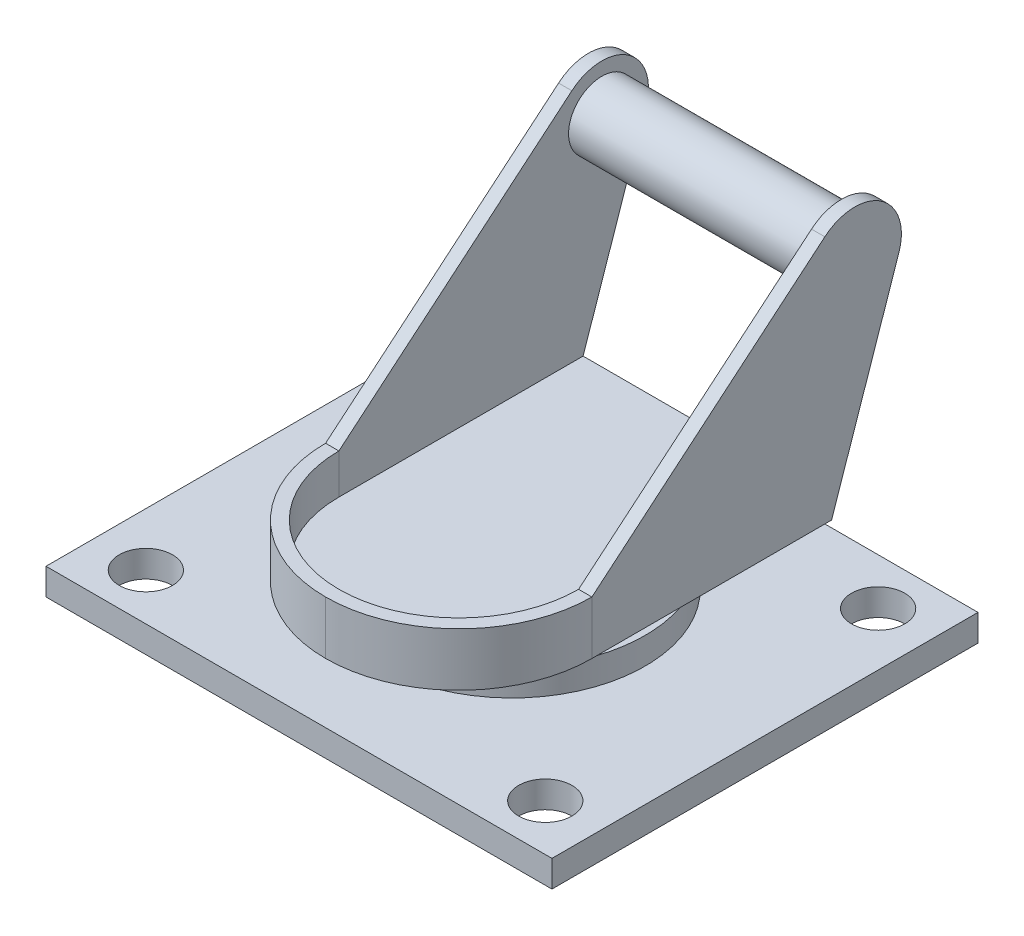
ISO-10303-21;
HEADER;
FILE_DESCRIPTION(('STEP AP214'),'2;1');
FILE_NAME('part.step','',(''),(''),'','','');
FILE_SCHEMA(('AUTOMOTIVE_DESIGN { 1 0 10303 214 1 1 1 1 }'));
ENDSEC;
DATA;
#1=APPLICATION_CONTEXT('core data for automotive mechanical design processes');
#2=APPLICATION_PROTOCOL_DEFINITION('international standard','automotive_design',2000,#1);
#3=PRODUCT_CONTEXT('',#1,'mechanical');
#4=PRODUCT('Part','Part','',(#3));
#5=PRODUCT_RELATED_PRODUCT_CATEGORY('part','',(#4));
#6=PRODUCT_DEFINITION_FORMATION('','',#4);
#7=PRODUCT_DEFINITION_CONTEXT('part definition',#1,'design');
#8=PRODUCT_DEFINITION('design','',#6,#7);
#9=PRODUCT_DEFINITION_SHAPE('','',#8);
#10=(LENGTH_UNIT() NAMED_UNIT(*) SI_UNIT(.MILLI.,.METRE.));
#11=(NAMED_UNIT(*) PLANE_ANGLE_UNIT() SI_UNIT($,.RADIAN.));
#12=(NAMED_UNIT(*) SI_UNIT($,.STERADIAN.) SOLID_ANGLE_UNIT());
#13=UNCERTAINTY_MEASURE_WITH_UNIT(LENGTH_MEASURE(1.E-05),#10,'distance_accuracy_value','');
#14=(GEOMETRIC_REPRESENTATION_CONTEXT(3) GLOBAL_UNCERTAINTY_ASSIGNED_CONTEXT((#13)) GLOBAL_UNIT_ASSIGNED_CONTEXT((#10,
#11,#12)) REPRESENTATION_CONTEXT('',''));
#15=CARTESIAN_POINT('',(0.,0.,0.));
#16=DIRECTION('',(0.,0.,1.));
#17=DIRECTION('',(1.,0.,0.));
#18=AXIS2_PLACEMENT_3D('',#15,#16,#17);
#19=CARTESIAN_POINT('',(10.,4.5,-14.));
#20=DIRECTION('',(0.,0.322065077503266,0.946717532241172));
#21=DIRECTION('',(0.,-0.946717532241172,0.322065077503266));
#22=AXIS2_PLACEMENT_3D('',#19,#20,#21);
#23=PLANE('',#22);
#24=DIRECTION('',(0.,0.946717532241172,-0.322065077503266));
#25=VECTOR('',#24,1.);
#26=CARTESIAN_POINT('',(-9.,4.5,-14.));
#27=LINE('',#26,#25);
#28=CARTESIAN_POINT('',(-9.,5.5,-14.3401913100107));
#29=VERTEX_POINT('',#28);
#30=CARTESIAN_POINT('',(-9.,19.3727722287386,-19.059587867986));
#31=VERTEX_POINT('',#30);
#32=EDGE_CURVE('E166',#29,#31,#27,.T.);
#33=ORIENTED_EDGE('',*,*,#32,.F.);
#34=DIRECTION('',(-1.,0.,0.));
#35=VECTOR('',#34,1.);
#36=CARTESIAN_POINT('',(10.,5.5,-14.3401913100107));
#37=LINE('',#36,#35);
#38=CARTESIAN_POINT('',(9.,5.5,-14.3401913100107));
#39=VERTEX_POINT('',#38);
#40=EDGE_CURVE('E178',#39,#29,#37,.T.);
#41=ORIENTED_EDGE('',*,*,#40,.F.);
#42=DIRECTION('',(0.,0.946717532241172,-0.322065077503266));
#43=VECTOR('',#42,1.);
#44=CARTESIAN_POINT('',(9.,4.5,-14.));
#45=LINE('',#44,#43);
#46=CARTESIAN_POINT('',(9.,19.3727722287386,-19.059587867986));
#47=VERTEX_POINT('',#46);
#48=EDGE_CURVE('E203',#39,#47,#45,.T.);
#49=ORIENTED_EDGE('',*,*,#48,.T.);
#50=DIRECTION('',(-1.,0.,0.));
#51=VECTOR('',#50,1.);
#52=CARTESIAN_POINT('',(10.,19.3727722287386,-19.059587867986));
#53=LINE('',#52,#51);
#54=CARTESIAN_POINT('',(10.,19.3727722287386,-19.059587867986));
#55=VERTEX_POINT('',#54);
#56=EDGE_CURVE('E246',#55,#47,#53,.T.);
#57=ORIENTED_EDGE('',*,*,#56,.F.);
#58=DIRECTION('',(0.,0.946717532241172,-0.322065077503266));
#59=VECTOR('',#58,1.);
#60=CARTESIAN_POINT('',(10.,4.5,-14.));
#61=LINE('',#60,#59);
#62=CARTESIAN_POINT('',(10.,4.5,-14.));
#63=VERTEX_POINT('',#62);
#64=EDGE_CURVE('E210',#63,#55,#61,.T.);
#65=ORIENTED_EDGE('',*,*,#64,.F.);
#66=DIRECTION('',(-1.,0.,0.));
#67=VECTOR('',#66,1.);
#68=CARTESIAN_POINT('',(10.,4.5,-14.));
#69=LINE('',#68,#67);
#70=CARTESIAN_POINT('',(-10.,4.5,-14.));
#71=VERTEX_POINT('',#70);
#72=EDGE_CURVE('E250',#63,#71,#69,.T.);
#73=ORIENTED_EDGE('',*,*,#72,.T.);
#74=DIRECTION('',(0.,0.946717532241172,-0.322065077503266));
#75=VECTOR('',#74,1.);
#76=CARTESIAN_POINT('',(-10.,4.5,-14.));
#77=LINE('',#76,#75);
#78=CARTESIAN_POINT('',(-10.,19.3727722287386,-19.059587867986));
#79=VERTEX_POINT('',#78);
#80=EDGE_CURVE('E225',#71,#79,#77,.T.);
#81=ORIENTED_EDGE('',*,*,#80,.T.);
#82=EDGE_CURVE('E245',#31,#79,#53,.T.);
#83=ORIENTED_EDGE('',*,*,#82,.F.);
#84=EDGE_LOOP('',(#33,#41,#49,#57,#65,#73,#81,#83));
#85=FACE_BOUND('',#84,.T.);
#86=ADVANCED_FACE('F51',(#85),#23,.F.);
#87=CARTESIAN_POINT('',(10.,20.5,-15.7460765051419));
#88=DIRECTION('',(-1.,0.,0.));
#89=DIRECTION('',(0.,0.,1.));
#90=AXIS2_PLACEMENT_3D('',#87,#88,#89);
#91=CYLINDRICAL_SURFACE('',#90,3.5);
#92=CARTESIAN_POINT('',(-9.,20.5,-15.7460765051419));
#93=DIRECTION('',(1.,0.,0.));
#94=DIRECTION('',(0.,0.,-1.));
#95=AXIS2_PLACEMENT_3D('',#92,#93,#94);
#96=CIRCLE('',#95,3.5);
#97=CARTESIAN_POINT('',(-9.,23.1811555509164,-13.496319871239));
#98=VERTEX_POINT('',#97);
#99=EDGE_CURVE('E184',#31,#98,#96,.T.);
#100=ORIENTED_EDGE('',*,*,#99,.F.);
#101=ORIENTED_EDGE('',*,*,#82,.T.);
#102=CARTESIAN_POINT('',(-10.,20.5,-15.7460765051419));
#103=DIRECTION('',(1.,0.,0.));
#104=DIRECTION('',(0.,0.,-1.));
#105=AXIS2_PLACEMENT_3D('',#102,#103,#104);
#106=CIRCLE('',#105,3.5);
#107=CARTESIAN_POINT('',(-10.,23.1811555509164,-13.496319871239));
#108=VERTEX_POINT('',#107);
#109=EDGE_CURVE('E229',#79,#108,#106,.T.);
#110=ORIENTED_EDGE('',*,*,#109,.T.);
#111=DIRECTION('',(-1.,0.,0.));
#112=VECTOR('',#111,1.);
#113=CARTESIAN_POINT('',(10.,23.1811555509164,-13.496319871239));
#114=LINE('',#113,#112);
#115=EDGE_CURVE('E240',#98,#108,#114,.T.);
#116=ORIENTED_EDGE('',*,*,#115,.F.);
#117=EDGE_LOOP('',(#100,#101,#110,#116));
#118=FACE_BOUND('',#117,.T.);
#119=ADVANCED_FACE('F333',(#118),#91,.T.);
#120=CARTESIAN_POINT('',(10.,8.5,4.));
#121=DIRECTION('',(0.,-0.766044443118977,-0.64278760968654));
#122=DIRECTION('',(0.,0.64278760968654,-0.766044443118977));
#123=AXIS2_PLACEMENT_3D('',#120,#121,#122);
#124=PLANE('',#123);
#125=DIRECTION('',(0.,-0.64278760968654,0.766044443118977));
#126=VECTOR('',#125,1.);
#127=CARTESIAN_POINT('',(-9.,8.5,4.));
#128=LINE('',#127,#126);
#129=CARTESIAN_POINT('',(-9.,8.5,4.));
#130=VERTEX_POINT('',#129);
#131=EDGE_CURVE('E187',#98,#130,#128,.T.);
#132=ORIENTED_EDGE('',*,*,#131,.F.);
#133=ORIENTED_EDGE('',*,*,#115,.T.);
#134=DIRECTION('',(0.,-0.64278760968654,0.766044443118977));
#135=VECTOR('',#134,1.);
#136=CARTESIAN_POINT('',(-10.,8.5,4.));
#137=LINE('',#136,#135);
#138=CARTESIAN_POINT('',(-10.,8.5,4.));
#139=VERTEX_POINT('',#138);
#140=EDGE_CURVE('E211',#108,#139,#137,.T.);
#141=ORIENTED_EDGE('',*,*,#140,.T.);
#142=DIRECTION('',(-1.,0.,0.));
#143=VECTOR('',#142,1.);
#144=CARTESIAN_POINT('',(10.,8.5,4.));
#145=LINE('',#144,#143);
#146=EDGE_CURVE('E221',#130,#139,#145,.T.);
#147=ORIENTED_EDGE('',*,*,#146,.F.);
#148=EDGE_LOOP('',(#132,#133,#141,#147));
#149=FACE_BOUND('',#148,.T.);
#150=ADVANCED_FACE('F338',(#149),#124,.F.);
#151=CARTESIAN_POINT('',(10.,8.5,14.));
#152=DIRECTION('',(0.,-1.,0.));
#153=DIRECTION('',(0.,0.,-1.));
#154=AXIS2_PLACEMENT_3D('',#151,#152,#153);
#155=PLANE('',#154);
#156=CARTESIAN_POINT('',(0.,8.5,4.));
#157=DIRECTION('',(0.,-1.,0.));
#158=DIRECTION('',(0.,0.,-1.));
#159=AXIS2_PLACEMENT_3D('',#156,#157,#158);
#160=CIRCLE('',#159,9.);
#161=CARTESIAN_POINT('',(0.,8.5,13.));
#162=VERTEX_POINT('',#161);
#163=EDGE_CURVE('E147',#130,#162,#160,.F.);
#164=ORIENTED_EDGE('',*,*,#163,.F.);
#165=ORIENTED_EDGE('',*,*,#146,.T.);
#166=CARTESIAN_POINT('',(0.,8.5,4.));
#167=DIRECTION('',(0.,-1.,0.));
#168=DIRECTION('',(0.,0.,-1.));
#169=AXIS2_PLACEMENT_3D('',#166,#167,#168);
#170=CIRCLE('',#169,10.);
#171=CARTESIAN_POINT('',(0.,8.5,14.));
#172=VERTEX_POINT('',#171);
#173=EDGE_CURVE('E75',#139,#172,#170,.F.);
#174=ORIENTED_EDGE('',*,*,#173,.T.);
#175=CARTESIAN_POINT('',(0.,8.5,4.));
#176=DIRECTION('',(0.,-1.,0.));
#177=DIRECTION('',(0.,0.,-1.));
#178=AXIS2_PLACEMENT_3D('',#175,#176,#177);
#179=CIRCLE('',#178,10.);
#180=CARTESIAN_POINT('',(10.,8.5,4.));
#181=VERTEX_POINT('',#180);
#182=EDGE_CURVE('E266',#172,#181,#179,.F.);
#183=ORIENTED_EDGE('',*,*,#182,.T.);
#184=CARTESIAN_POINT('',(9.,8.5,4.));
#185=VERTEX_POINT('',#184);
#186=EDGE_CURVE('E236',#181,#185,#145,.T.);
#187=ORIENTED_EDGE('',*,*,#186,.T.);
#188=CARTESIAN_POINT('',(0.,8.5,4.));
#189=DIRECTION('',(0.,-1.,0.));
#190=DIRECTION('',(0.,0.,-1.));
#191=AXIS2_PLACEMENT_3D('',#188,#189,#190);
#192=CIRCLE('',#191,9.);
#193=EDGE_CURVE('E177',#162,#185,#192,.F.);
#194=ORIENTED_EDGE('',*,*,#193,.F.);
#195=EDGE_LOOP('',(#164,#165,#174,#183,#187,#194));
#196=FACE_BOUND('',#195,.T.);
#197=ADVANCED_FACE('F304',(#196),#155,.F.);
#198=CARTESIAN_POINT('',(10.,4.5,14.));
#199=DIRECTION('',(0.,1.,0.));
#200=DIRECTION('',(0.,0.,1.));
#201=AXIS2_PLACEMENT_3D('',#198,#199,#200);
#202=PLANE('',#201);
#203=CARTESIAN_POINT('',(0.,4.5,0.));
#204=DIRECTION('',(0.,-1.,0.));
#205=DIRECTION('',(0.,0.,-1.));
#206=AXIS2_PLACEMENT_3D('',#203,#204,#205);
#207=CIRCLE('',#206,8.);
#208=CARTESIAN_POINT('',(0.,4.5,-8.));
#209=VERTEX_POINT('',#208);
#210=EDGE_CURVE('E60',#209,#209,#207,.T.);
#211=ORIENTED_EDGE('',*,*,#210,.F.);
#212=EDGE_LOOP('',(#211));
#213=FACE_BOUND('',#212,.T.);
#214=DIRECTION('',(0.,0.,-1.));
#215=VECTOR('',#214,1.);
#216=CARTESIAN_POINT('',(10.,4.5,14.));
#217=LINE('',#216,#215);
#218=CARTESIAN_POINT('',(10.,4.5,4.));
#219=VERTEX_POINT('',#218);
#220=EDGE_CURVE('E207',#219,#63,#217,.T.);
#221=ORIENTED_EDGE('',*,*,#220,.F.);
#222=CARTESIAN_POINT('',(0.,4.5,4.));
#223=DIRECTION('',(0.,1.,0.));
#224=DIRECTION('',(0.,0.,1.));
#225=AXIS2_PLACEMENT_3D('',#222,#223,#224);
#226=CIRCLE('',#225,10.);
#227=CARTESIAN_POINT('',(0.,4.5,14.));
#228=VERTEX_POINT('',#227);
#229=EDGE_CURVE('E261',#219,#228,#226,.F.);
#230=ORIENTED_EDGE('',*,*,#229,.T.);
#231=CARTESIAN_POINT('',(0.,4.5,4.));
#232=DIRECTION('',(0.,1.,0.));
#233=DIRECTION('',(0.,0.,1.));
#234=AXIS2_PLACEMENT_3D('',#231,#232,#233);
#235=CIRCLE('',#234,10.);
#236=CARTESIAN_POINT('',(-10.,4.5,4.));
#237=VERTEX_POINT('',#236);
#238=EDGE_CURVE('E258',#228,#237,#235,.F.);
#239=ORIENTED_EDGE('',*,*,#238,.T.);
#240=DIRECTION('',(0.,0.,-1.));
#241=VECTOR('',#240,1.);
#242=CARTESIAN_POINT('',(-10.,4.5,14.));
#243=LINE('',#242,#241);
#244=EDGE_CURVE('E222',#237,#71,#243,.T.);
#245=ORIENTED_EDGE('',*,*,#244,.T.);
#246=ORIENTED_EDGE('',*,*,#72,.F.);
#247=EDGE_LOOP('',(#221,#230,#239,#245,#246));
#248=FACE_BOUND('',#247,.T.);
#249=ADVANCED_FACE('F284',(#213,#248),#202,.F.);
#250=ORIENTED_EDGE('',*,*,#56,.T.);
#251=CARTESIAN_POINT('',(9.,20.5,-15.7460765051419));
#252=DIRECTION('',(1.,0.,0.));
#253=DIRECTION('',(0.,0.,-1.));
#254=AXIS2_PLACEMENT_3D('',#251,#252,#253);
#255=CIRCLE('',#254,3.5);
#256=CARTESIAN_POINT('',(9.,23.1811555509164,-13.496319871239));
#257=VERTEX_POINT('',#256);
#258=EDGE_CURVE('E199',#47,#257,#255,.T.);
#259=ORIENTED_EDGE('',*,*,#258,.T.);
#260=CARTESIAN_POINT('',(10.,23.1811555509164,-13.496319871239));
#261=VERTEX_POINT('',#260);
#262=EDGE_CURVE('E241',#261,#257,#114,.T.);
#263=ORIENTED_EDGE('',*,*,#262,.F.);
#264=CARTESIAN_POINT('',(10.,20.5,-15.7460765051419));
#265=DIRECTION('',(1.,0.,0.));
#266=DIRECTION('',(0.,0.,-1.));
#267=AXIS2_PLACEMENT_3D('',#264,#265,#266);
#268=CIRCLE('',#267,3.5);
#269=EDGE_CURVE('E214',#55,#261,#268,.T.);
#270=ORIENTED_EDGE('',*,*,#269,.F.);
#271=EDGE_LOOP('',(#250,#259,#263,#270));
#272=FACE_BOUND('',#271,.T.);
#273=ADVANCED_FACE('F341',(#272),#91,.T.);
#274=ORIENTED_EDGE('',*,*,#262,.T.);
#275=DIRECTION('',(0.,-0.64278760968654,0.766044443118977));
#276=VECTOR('',#275,1.);
#277=CARTESIAN_POINT('',(9.,8.5,4.));
#278=LINE('',#277,#276);
#279=EDGE_CURVE('E181',#257,#185,#278,.T.);
#280=ORIENTED_EDGE('',*,*,#279,.T.);
#281=ORIENTED_EDGE('',*,*,#186,.F.);
#282=DIRECTION('',(0.,-0.64278760968654,0.766044443118977));
#283=VECTOR('',#282,1.);
#284=CARTESIAN_POINT('',(10.,8.5,4.));
#285=LINE('',#284,#283);
#286=EDGE_CURVE('E217',#261,#181,#285,.T.);
#287=ORIENTED_EDGE('',*,*,#286,.F.);
#288=EDGE_LOOP('',(#274,#280,#281,#287));
#289=FACE_BOUND('',#288,.T.);
#290=ADVANCED_FACE('F303',(#289),#124,.F.);
#291=CARTESIAN_POINT('',(10.,20.5,-15.7460765051419));
#292=DIRECTION('',(1.,0.,0.));
#293=DIRECTION('',(0.,0.,-1.));
#294=AXIS2_PLACEMENT_3D('',#291,#292,#293);
#295=PLANE('',#294);
#296=ORIENTED_EDGE('',*,*,#286,.T.);
#297=DIRECTION('',(0.,-1.,0.));
#298=VECTOR('',#297,1.);
#299=CARTESIAN_POINT('',(10.,4.5,4.));
#300=LINE('',#299,#298);
#301=EDGE_CURVE('E254',#181,#219,#300,.T.);
#302=ORIENTED_EDGE('',*,*,#301,.T.);
#303=ORIENTED_EDGE('',*,*,#220,.T.);
#304=ORIENTED_EDGE('',*,*,#64,.T.);
#305=ORIENTED_EDGE('',*,*,#269,.T.);
#306=EDGE_LOOP('',(#296,#302,#303,#304,#305));
#307=FACE_BOUND('',#306,.T.);
#308=ADVANCED_FACE('F297',(#307),#295,.T.);
#309=CARTESIAN_POINT('',(-10.,20.5,-15.7460765051419));
#310=DIRECTION('',(1.,0.,0.));
#311=DIRECTION('',(0.,0.,-1.));
#312=AXIS2_PLACEMENT_3D('',#309,#310,#311);
#313=PLANE('',#312);
#314=ORIENTED_EDGE('',*,*,#244,.F.);
#315=DIRECTION('',(0.,-1.,0.));
#316=VECTOR('',#315,1.);
#317=CARTESIAN_POINT('',(-10.,20.5,4.));
#318=LINE('',#317,#316);
#319=EDGE_CURVE('E269',#237,#139,#318,.F.);
#320=ORIENTED_EDGE('',*,*,#319,.T.);
#321=ORIENTED_EDGE('',*,*,#140,.F.);
#322=ORIENTED_EDGE('',*,*,#109,.F.);
#323=ORIENTED_EDGE('',*,*,#80,.F.);
#324=EDGE_LOOP('',(#314,#320,#321,#322,#323));
#325=FACE_BOUND('',#324,.T.);
#326=ADVANCED_FACE('F288',(#325),#313,.F.);
#327=CARTESIAN_POINT('',(0.,4.5,4.));
#328=DIRECTION('',(0.,-1.,0.));
#329=DIRECTION('',(0.,0.,-1.));
#330=AXIS2_PLACEMENT_3D('',#327,#328,#329);
#331=CYLINDRICAL_SURFACE('',#330,10.);
#332=DIRECTION('',(0.,-1.,0.));
#333=VECTOR('',#332,1.);
#334=CARTESIAN_POINT('',(0.,4.5,14.));
#335=LINE('',#334,#333);
#336=EDGE_CURVE('E176',#172,#228,#335,.T.);
#337=ORIENTED_EDGE('',*,*,#336,.F.);
#338=ORIENTED_EDGE('',*,*,#173,.F.);
#339=ORIENTED_EDGE('',*,*,#319,.F.);
#340=ORIENTED_EDGE('',*,*,#238,.F.);
#341=EDGE_LOOP('',(#337,#338,#339,#340));
#342=FACE_BOUND('',#341,.T.);
#343=ADVANCED_FACE('F53',(#342),#331,.T.);
#344=CARTESIAN_POINT('',(0.,20.5,4.));
#345=DIRECTION('',(0.,1.,0.));
#346=DIRECTION('',(0.,0.,1.));
#347=AXIS2_PLACEMENT_3D('',#344,#345,#346);
#348=CYLINDRICAL_SURFACE('',#347,10.);
#349=ORIENTED_EDGE('',*,*,#182,.F.);
#350=ORIENTED_EDGE('',*,*,#336,.T.);
#351=ORIENTED_EDGE('',*,*,#229,.F.);
#352=ORIENTED_EDGE('',*,*,#301,.F.);
#353=EDGE_LOOP('',(#349,#350,#351,#352));
#354=FACE_BOUND('',#353,.T.);
#355=ADVANCED_FACE('F276',(#354),#348,.T.);
#356=CARTESIAN_POINT('',(10.,5.5,14.));
#357=DIRECTION('',(0.,1.,0.));
#358=DIRECTION('',(0.,0.,1.));
#359=AXIS2_PLACEMENT_3D('',#356,#357,#358);
#360=PLANE('',#359);
#361=DIRECTION('',(0.,0.,-1.));
#362=VECTOR('',#361,1.);
#363=CARTESIAN_POINT('',(9.,5.5,14.));
#364=LINE('',#363,#362);
#365=CARTESIAN_POINT('',(9.,5.5,4.));
#366=VERTEX_POINT('',#365);
#367=EDGE_CURVE('E191',#366,#39,#364,.T.);
#368=ORIENTED_EDGE('',*,*,#367,.T.);
#369=ORIENTED_EDGE('',*,*,#40,.T.);
#370=DIRECTION('',(0.,0.,-1.));
#371=VECTOR('',#370,1.);
#372=CARTESIAN_POINT('',(-9.,5.5,14.));
#373=LINE('',#372,#371);
#374=CARTESIAN_POINT('',(-9.,5.5,4.));
#375=VERTEX_POINT('',#374);
#376=EDGE_CURVE('E153',#375,#29,#373,.T.);
#377=ORIENTED_EDGE('',*,*,#376,.F.);
#378=CARTESIAN_POINT('',(0.,5.5,4.));
#379=DIRECTION('',(0.,1.,0.));
#380=DIRECTION('',(0.,0.,1.));
#381=AXIS2_PLACEMENT_3D('',#378,#379,#380);
#382=CIRCLE('',#381,9.);
#383=CARTESIAN_POINT('',(0.,5.5,13.));
#384=VERTEX_POINT('',#383);
#385=EDGE_CURVE('E148',#384,#375,#382,.F.);
#386=ORIENTED_EDGE('',*,*,#385,.F.);
#387=CARTESIAN_POINT('',(0.,5.5,4.));
#388=DIRECTION('',(0.,1.,0.));
#389=DIRECTION('',(0.,0.,1.));
#390=AXIS2_PLACEMENT_3D('',#387,#388,#389);
#391=CIRCLE('',#390,9.);
#392=EDGE_CURVE('E139',#366,#384,#391,.F.);
#393=ORIENTED_EDGE('',*,*,#392,.F.);
#394=EDGE_LOOP('',(#368,#369,#377,#386,#393));
#395=FACE_BOUND('',#394,.T.);
#396=ADVANCED_FACE('F151',(#395),#360,.T.);
#397=CARTESIAN_POINT('',(9.,20.5,-15.7460765051419));
#398=DIRECTION('',(1.,0.,0.));
#399=DIRECTION('',(0.,0.,-1.));
#400=AXIS2_PLACEMENT_3D('',#397,#398,#399);
#401=PLANE('',#400);
#402=CARTESIAN_POINT('',(9.,20.5,-15.7460765051419));
#403=DIRECTION('',(1.,0.,0.));
#404=DIRECTION('',(0.,0.,-1.));
#405=AXIS2_PLACEMENT_3D('',#402,#403,#404);
#406=CIRCLE('',#405,2.5);
#407=CARTESIAN_POINT('',(9.,20.5,-18.2460765051419));
#408=VERTEX_POINT('',#407);
#409=EDGE_CURVE('E169',#408,#408,#406,.T.);
#410=ORIENTED_EDGE('',*,*,#409,.T.);
#411=EDGE_LOOP('',(#410));
#412=FACE_BOUND('',#411,.T.);
#413=ORIENTED_EDGE('',*,*,#279,.F.);
#414=ORIENTED_EDGE('',*,*,#258,.F.);
#415=ORIENTED_EDGE('',*,*,#48,.F.);
#416=ORIENTED_EDGE('',*,*,#367,.F.);
#417=DIRECTION('',(0.,1.,0.));
#418=VECTOR('',#417,1.);
#419=CARTESIAN_POINT('',(9.,20.5,4.));
#420=LINE('',#419,#418);
#421=EDGE_CURVE('E143',#185,#366,#420,.F.);
#422=ORIENTED_EDGE('',*,*,#421,.F.);
#423=EDGE_LOOP('',(#413,#414,#415,#416,#422));
#424=FACE_BOUND('',#423,.T.);
#425=ADVANCED_FACE('F307',(#412,#424),#401,.F.);
#426=CARTESIAN_POINT('',(-9.,20.5,-15.7460765051419));
#427=DIRECTION('',(1.,0.,0.));
#428=DIRECTION('',(0.,0.,-1.));
#429=AXIS2_PLACEMENT_3D('',#426,#427,#428);
#430=PLANE('',#429);
#431=CARTESIAN_POINT('',(-9.,20.5,-15.7460765051419));
#432=DIRECTION('',(1.,0.,0.));
#433=DIRECTION('',(0.,0.,-1.));
#434=AXIS2_PLACEMENT_3D('',#431,#432,#433);
#435=CIRCLE('',#434,2.5);
#436=CARTESIAN_POINT('',(-9.,20.5,-18.2460765051419));
#437=VERTEX_POINT('',#436);
#438=EDGE_CURVE('E12',#437,#437,#435,.T.);
#439=ORIENTED_EDGE('',*,*,#438,.F.);
#440=EDGE_LOOP('',(#439));
#441=FACE_BOUND('',#440,.T.);
#442=ORIENTED_EDGE('',*,*,#376,.T.);
#443=ORIENTED_EDGE('',*,*,#32,.T.);
#444=ORIENTED_EDGE('',*,*,#99,.T.);
#445=ORIENTED_EDGE('',*,*,#131,.T.);
#446=DIRECTION('',(0.,1.,0.));
#447=VECTOR('',#446,1.);
#448=CARTESIAN_POINT('',(-9.,20.5,4.));
#449=LINE('',#448,#447);
#450=EDGE_CURVE('E173',#375,#130,#449,.T.);
#451=ORIENTED_EDGE('',*,*,#450,.F.);
#452=EDGE_LOOP('',(#442,#443,#444,#445,#451));
#453=FACE_BOUND('',#452,.T.);
#454=ADVANCED_FACE('F379',(#441,#453),#430,.T.);
#455=CARTESIAN_POINT('',(0.,4.5,4.));
#456=DIRECTION('',(0.,-1.,0.));
#457=DIRECTION('',(0.,0.,-1.));
#458=AXIS2_PLACEMENT_3D('',#455,#456,#457);
#459=CYLINDRICAL_SURFACE('',#458,9.);
#460=DIRECTION('',(0.,1.,0.));
#461=VECTOR('',#460,1.);
#462=CARTESIAN_POINT('',(0.,20.5,13.));
#463=LINE('',#462,#461);
#464=EDGE_CURVE('E67',#162,#384,#463,.F.);
#465=ORIENTED_EDGE('',*,*,#464,.T.);
#466=ORIENTED_EDGE('',*,*,#385,.T.);
#467=ORIENTED_EDGE('',*,*,#450,.T.);
#468=ORIENTED_EDGE('',*,*,#163,.T.);
#469=EDGE_LOOP('',(#465,#466,#467,#468));
#470=FACE_BOUND('',#469,.T.);
#471=ADVANCED_FACE('F158',(#470),#459,.F.);
#472=CARTESIAN_POINT('',(0.,20.5,4.));
#473=DIRECTION('',(0.,1.,0.));
#474=DIRECTION('',(0.,0.,1.));
#475=AXIS2_PLACEMENT_3D('',#472,#473,#474);
#476=CYLINDRICAL_SURFACE('',#475,9.);
#477=ORIENTED_EDGE('',*,*,#193,.T.);
#478=ORIENTED_EDGE('',*,*,#421,.T.);
#479=ORIENTED_EDGE('',*,*,#392,.T.);
#480=ORIENTED_EDGE('',*,*,#464,.F.);
#481=EDGE_LOOP('',(#477,#478,#479,#480));
#482=FACE_BOUND('',#481,.T.);
#483=ADVANCED_FACE('F141',(#482),#476,.F.);
#484=CARTESIAN_POINT('',(0.,2.,0.));
#485=DIRECTION('',(0.,1.,0.));
#486=DIRECTION('',(0.,0.,1.));
#487=AXIS2_PLACEMENT_3D('',#484,#485,#486);
#488=CYLINDRICAL_SURFACE('',#487,8.);
#489=CARTESIAN_POINT('',(0.,2.,0.));
#490=DIRECTION('',(0.,-1.,0.));
#491=DIRECTION('',(0.,0.,-1.));
#492=AXIS2_PLACEMENT_3D('',#489,#490,#491);
#493=CIRCLE('',#492,8.);
#494=CARTESIAN_POINT('',(0.,2.,-8.));
#495=VERTEX_POINT('',#494);
#496=EDGE_CURVE('E162',#495,#495,#493,.T.);
#497=ORIENTED_EDGE('',*,*,#496,.F.);
#498=EDGE_LOOP('',(#497));
#499=FACE_BOUND('',#498,.T.);
#500=ORIENTED_EDGE('',*,*,#210,.T.);
#501=EDGE_LOOP('',(#500));
#502=FACE_BOUND('',#501,.T.);
#503=ADVANCED_FACE('F329',(#499,#502),#488,.T.);
#504=CARTESIAN_POINT('',(0.,2.,0.));
#505=DIRECTION('',(0.,-1.,0.));
#506=DIRECTION('',(0.,0.,-1.));
#507=AXIS2_PLACEMENT_3D('',#504,#505,#506);
#508=PLANE('',#507);
#509=ORIENTED_EDGE('',*,*,#496,.T.);
#510=EDGE_LOOP('',(#509));
#511=FACE_BOUND('',#510,.T.);
#512=ADVANCED_FACE('F323',(#511),#508,.T.);
#513=CARTESIAN_POINT('',(10.,20.5,-15.7460765051419));
#514=DIRECTION('',(-1.,0.,0.));
#515=DIRECTION('',(0.,0.,1.));
#516=AXIS2_PLACEMENT_3D('',#513,#514,#515);
#517=CYLINDRICAL_SURFACE('',#516,2.5);
#518=ORIENTED_EDGE('',*,*,#438,.T.);
#519=EDGE_LOOP('',(#518));
#520=FACE_BOUND('',#519,.T.);
#521=ORIENTED_EDGE('',*,*,#409,.F.);
#522=EDGE_LOOP('',(#521));
#523=FACE_BOUND('',#522,.T.);
#524=ADVANCED_FACE('F321',(#520,#523),#517,.T.);
#525=CLOSED_SHELL('',(#86,#119,#150,#197,#249,#273,#290,#308,#326,#343,#355,#396,#425,#454,#471,
#483,#503,#512,#524));
#526=MANIFOLD_SOLID_BREP('B2',#525);
#527=CARTESIAN_POINT('',(0.,2.,0.));
#528=DIRECTION('',(0.,-1.,0.));
#529=DIRECTION('',(0.,0.,-1.));
#530=AXIS2_PLACEMENT_3D('',#527,#528,#529);
#531=PLANE('',#530);
#532=CARTESIAN_POINT('',(0.,2.,0.));
#533=DIRECTION('',(0.,-1.,0.));
#534=DIRECTION('',(0.,0.,-1.));
#535=AXIS2_PLACEMENT_3D('',#532,#533,#534);
#536=CIRCLE('',#535,10.);
#537=CARTESIAN_POINT('',(0.,2.,-10.));
#538=VERTEX_POINT('',#537);
#539=EDGE_CURVE('E49',#538,#538,#536,.F.);
#540=ORIENTED_EDGE('',*,*,#539,.F.);
#541=EDGE_LOOP('',(#540));
#542=FACE_BOUND('',#541,.T.);
#543=DIRECTION('',(0.,0.,-1.));
#544=VECTOR('',#543,1.);
#545=CARTESIAN_POINT('',(19.,2.,16.));
#546=LINE('',#545,#544);
#547=CARTESIAN_POINT('',(19.,2.,16.));
#548=VERTEX_POINT('',#547);
#549=CARTESIAN_POINT('',(19.,2.,-16.));
#550=VERTEX_POINT('',#549);
#551=EDGE_CURVE('E552',#548,#550,#546,.T.);
#552=ORIENTED_EDGE('',*,*,#551,.T.);
#553=DIRECTION('',(-1.,0.,0.));
#554=VECTOR('',#553,1.);
#555=CARTESIAN_POINT('',(-19.,2.,-16.));
#556=LINE('',#555,#554);
#557=CARTESIAN_POINT('',(-19.,2.,-16.));
#558=VERTEX_POINT('',#557);
#559=EDGE_CURVE('E547',#550,#558,#556,.T.);
#560=ORIENTED_EDGE('',*,*,#559,.T.);
#561=DIRECTION('',(0.,0.,1.));
#562=VECTOR('',#561,1.);
#563=CARTESIAN_POINT('',(-19.,2.,16.));
#564=LINE('',#563,#562);
#565=CARTESIAN_POINT('',(-19.,2.,16.));
#566=VERTEX_POINT('',#565);
#567=EDGE_CURVE('E550',#558,#566,#564,.T.);
#568=ORIENTED_EDGE('',*,*,#567,.T.);
#569=DIRECTION('',(1.,0.,0.));
#570=VECTOR('',#569,1.);
#571=CARTESIAN_POINT('',(-19.,2.,16.));
#572=LINE('',#571,#570);
#573=EDGE_CURVE('E516',#566,#548,#572,.T.);
#574=ORIENTED_EDGE('',*,*,#573,.T.);
#575=EDGE_LOOP('',(#552,#560,#568,#574));
#576=FACE_BOUND('',#575,.T.);
#577=CARTESIAN_POINT('',(-15.,2.,-12.5));
#578=DIRECTION('',(0.,1.,0.));
#579=DIRECTION('',(0.,0.,1.));
#580=AXIS2_PLACEMENT_3D('',#577,#578,#579);
#581=CIRCLE('',#580,2.);
#582=CARTESIAN_POINT('',(-15.,2.,-10.5));
#583=VERTEX_POINT('',#582);
#584=EDGE_CURVE('E569',#583,#583,#581,.T.);
#585=ORIENTED_EDGE('',*,*,#584,.F.);
#586=EDGE_LOOP('',(#585));
#587=FACE_BOUND('',#586,.T.);
#588=CARTESIAN_POINT('',(15.,2.,-12.5));
#589=DIRECTION('',(0.,1.,0.));
#590=DIRECTION('',(0.,0.,-1.));
#591=AXIS2_PLACEMENT_3D('',#588,#589,#590);
#592=CIRCLE('',#591,2.);
#593=CARTESIAN_POINT('',(15.,2.,-14.5));
#594=VERTEX_POINT('',#593);
#595=EDGE_CURVE('E605',#594,#594,#592,.T.);
#596=ORIENTED_EDGE('',*,*,#595,.F.);
#597=EDGE_LOOP('',(#596));
#598=FACE_BOUND('',#597,.T.);
#599=CARTESIAN_POINT('',(-15.,2.,12.5));
#600=DIRECTION('',(0.,1.,0.));
#601=DIRECTION('',(0.,0.,-1.));
#602=AXIS2_PLACEMENT_3D('',#599,#600,#601);
#603=CIRCLE('',#602,2.);
#604=CARTESIAN_POINT('',(-15.,2.,10.5));
#605=VERTEX_POINT('',#604);
#606=EDGE_CURVE('E600',#605,#605,#603,.T.);
#607=ORIENTED_EDGE('',*,*,#606,.F.);
#608=EDGE_LOOP('',(#607));
#609=FACE_BOUND('',#608,.T.);
#610=CARTESIAN_POINT('',(15.,2.,12.5));
#611=DIRECTION('',(0.,1.,0.));
#612=DIRECTION('',(0.,0.,1.));
#613=AXIS2_PLACEMENT_3D('',#610,#611,#612);
#614=CIRCLE('',#613,2.);
#615=CARTESIAN_POINT('',(15.,2.,14.5));
#616=VERTEX_POINT('',#615);
#617=EDGE_CURVE('E590',#616,#616,#614,.T.);
#618=ORIENTED_EDGE('',*,*,#617,.F.);
#619=EDGE_LOOP('',(#618));
#620=FACE_BOUND('',#619,.T.);
#621=ADVANCED_FACE('F499',(#542,#576,#587,#598,#609,#620),#531,.F.);
#622=CARTESIAN_POINT('',(0.,0.,0.));
#623=DIRECTION('',(0.,-1.,0.));
#624=DIRECTION('',(0.,0.,-1.));
#625=AXIS2_PLACEMENT_3D('',#622,#623,#624);
#626=PLANE('',#625);
#627=CARTESIAN_POINT('',(-15.,0.,12.5));
#628=DIRECTION('',(0.,1.,0.));
#629=DIRECTION('',(0.,0.,-1.));
#630=AXIS2_PLACEMENT_3D('',#627,#628,#629);
#631=CIRCLE('',#630,2.);
#632=CARTESIAN_POINT('',(-15.,0.,10.5));
#633=VERTEX_POINT('',#632);
#634=EDGE_CURVE('E594',#633,#633,#631,.T.);
#635=ORIENTED_EDGE('',*,*,#634,.T.);
#636=EDGE_LOOP('',(#635));
#637=FACE_BOUND('',#636,.T.);
#638=CARTESIAN_POINT('',(-15.,0.,-12.5));
#639=DIRECTION('',(0.,1.,0.));
#640=DIRECTION('',(0.,0.,1.));
#641=AXIS2_PLACEMENT_3D('',#638,#639,#640);
#642=CIRCLE('',#641,2.);
#643=CARTESIAN_POINT('',(-15.,0.,-10.5));
#644=VERTEX_POINT('',#643);
#645=EDGE_CURVE('E608',#644,#644,#642,.T.);
#646=ORIENTED_EDGE('',*,*,#645,.T.);
#647=EDGE_LOOP('',(#646));
#648=FACE_BOUND('',#647,.T.);
#649=DIRECTION('',(0.,0.,-1.));
#650=VECTOR('',#649,1.);
#651=CARTESIAN_POINT('',(19.,0.,16.));
#652=LINE('',#651,#650);
#653=CARTESIAN_POINT('',(19.,0.,16.));
#654=VERTEX_POINT('',#653);
#655=CARTESIAN_POINT('',(19.,0.,-16.));
#656=VERTEX_POINT('',#655);
#657=EDGE_CURVE('E566',#654,#656,#652,.T.);
#658=ORIENTED_EDGE('',*,*,#657,.F.);
#659=DIRECTION('',(1.,0.,0.));
#660=VECTOR('',#659,1.);
#661=CARTESIAN_POINT('',(-19.,0.,16.));
#662=LINE('',#661,#660);
#663=CARTESIAN_POINT('',(-19.,0.,16.));
#664=VERTEX_POINT('',#663);
#665=EDGE_CURVE('E539',#664,#654,#662,.T.);
#666=ORIENTED_EDGE('',*,*,#665,.F.);
#667=DIRECTION('',(0.,0.,1.));
#668=VECTOR('',#667,1.);
#669=CARTESIAN_POINT('',(-19.,0.,16.));
#670=LINE('',#669,#668);
#671=CARTESIAN_POINT('',(-19.,0.,-16.));
#672=VERTEX_POINT('',#671);
#673=EDGE_CURVE('E533',#672,#664,#670,.T.);
#674=ORIENTED_EDGE('',*,*,#673,.F.);
#675=DIRECTION('',(-1.,0.,0.));
#676=VECTOR('',#675,1.);
#677=CARTESIAN_POINT('',(-19.,0.,-16.));
#678=LINE('',#677,#676);
#679=EDGE_CURVE('E557',#656,#672,#678,.T.);
#680=ORIENTED_EDGE('',*,*,#679,.F.);
#681=EDGE_LOOP('',(#658,#666,#674,#680));
#682=FACE_BOUND('',#681,.T.);
#683=CARTESIAN_POINT('',(15.,0.,-12.5));
#684=DIRECTION('',(0.,1.,0.));
#685=DIRECTION('',(0.,0.,-1.));
#686=AXIS2_PLACEMENT_3D('',#683,#684,#685);
#687=CIRCLE('',#686,2.);
#688=CARTESIAN_POINT('',(15.,0.,-14.5));
#689=VERTEX_POINT('',#688);
#690=EDGE_CURVE('E585',#689,#689,#687,.T.);
#691=ORIENTED_EDGE('',*,*,#690,.T.);
#692=EDGE_LOOP('',(#691));
#693=FACE_BOUND('',#692,.T.);
#694=CARTESIAN_POINT('',(15.,0.,12.5));
#695=DIRECTION('',(0.,1.,0.));
#696=DIRECTION('',(0.,0.,1.));
#697=AXIS2_PLACEMENT_3D('',#694,#695,#696);
#698=CIRCLE('',#697,2.);
#699=CARTESIAN_POINT('',(15.,0.,14.5));
#700=VERTEX_POINT('',#699);
#701=EDGE_CURVE('E588',#700,#700,#698,.T.);
#702=ORIENTED_EDGE('',*,*,#701,.T.);
#703=EDGE_LOOP('',(#702));
#704=FACE_BOUND('',#703,.T.);
#705=ADVANCED_FACE('F577',(#637,#648,#682,#693,#704),#626,.T.);
#706=CARTESIAN_POINT('',(19.,2.,16.));
#707=DIRECTION('',(-1.,0.,0.));
#708=DIRECTION('',(0.,0.,1.));
#709=AXIS2_PLACEMENT_3D('',#706,#707,#708);
#710=PLANE('',#709);
#711=ORIENTED_EDGE('',*,*,#657,.T.);
#712=DIRECTION('',(0.,-1.,0.));
#713=VECTOR('',#712,1.);
#714=CARTESIAN_POINT('',(19.,2.,-16.));
#715=LINE('',#714,#713);
#716=EDGE_CURVE('E508',#550,#656,#715,.T.);
#717=ORIENTED_EDGE('',*,*,#716,.F.);
#718=ORIENTED_EDGE('',*,*,#551,.F.);
#719=DIRECTION('',(0.,-1.,0.));
#720=VECTOR('',#719,1.);
#721=CARTESIAN_POINT('',(19.,2.,16.));
#722=LINE('',#721,#720);
#723=EDGE_CURVE('E562',#548,#654,#722,.T.);
#724=ORIENTED_EDGE('',*,*,#723,.T.);
#725=EDGE_LOOP('',(#711,#717,#718,#724));
#726=FACE_BOUND('',#725,.T.);
#727=ADVANCED_FACE('F501',(#726),#710,.F.);
#728=CARTESIAN_POINT('',(-19.,2.,-16.));
#729=DIRECTION('',(0.,0.,1.));
#730=DIRECTION('',(1.,0.,0.));
#731=AXIS2_PLACEMENT_3D('',#728,#729,#730);
#732=PLANE('',#731);
#733=ORIENTED_EDGE('',*,*,#679,.T.);
#734=DIRECTION('',(0.,-1.,0.));
#735=VECTOR('',#734,1.);
#736=CARTESIAN_POINT('',(-19.,2.,-16.));
#737=LINE('',#736,#735);
#738=EDGE_CURVE('E555',#558,#672,#737,.T.);
#739=ORIENTED_EDGE('',*,*,#738,.F.);
#740=ORIENTED_EDGE('',*,*,#559,.F.);
#741=ORIENTED_EDGE('',*,*,#716,.T.);
#742=EDGE_LOOP('',(#733,#739,#740,#741));
#743=FACE_BOUND('',#742,.T.);
#744=ADVANCED_FACE('F556',(#743),#732,.F.);
#745=CARTESIAN_POINT('',(-19.,2.,16.));
#746=DIRECTION('',(1.,0.,0.));
#747=DIRECTION('',(0.,0.,-1.));
#748=AXIS2_PLACEMENT_3D('',#745,#746,#747);
#749=PLANE('',#748);
#750=ORIENTED_EDGE('',*,*,#673,.T.);
#751=DIRECTION('',(0.,-1.,0.));
#752=VECTOR('',#751,1.);
#753=CARTESIAN_POINT('',(-19.,2.,16.));
#754=LINE('',#753,#752);
#755=EDGE_CURVE('E558',#566,#664,#754,.T.);
#756=ORIENTED_EDGE('',*,*,#755,.F.);
#757=ORIENTED_EDGE('',*,*,#567,.F.);
#758=ORIENTED_EDGE('',*,*,#738,.T.);
#759=EDGE_LOOP('',(#750,#756,#757,#758));
#760=FACE_BOUND('',#759,.T.);
#761=ADVANCED_FACE('F560',(#760),#749,.F.);
#762=CARTESIAN_POINT('',(-19.,2.,16.));
#763=DIRECTION('',(0.,0.,-1.));
#764=DIRECTION('',(-1.,0.,0.));
#765=AXIS2_PLACEMENT_3D('',#762,#763,#764);
#766=PLANE('',#765);
#767=ORIENTED_EDGE('',*,*,#665,.T.);
#768=ORIENTED_EDGE('',*,*,#723,.F.);
#769=ORIENTED_EDGE('',*,*,#573,.F.);
#770=ORIENTED_EDGE('',*,*,#755,.T.);
#771=EDGE_LOOP('',(#767,#768,#769,#770));
#772=FACE_BOUND('',#771,.T.);
#773=ADVANCED_FACE('F619',(#772),#766,.F.);
#774=CARTESIAN_POINT('',(-15.,2.,-12.5));
#775=DIRECTION('',(0.,-1.,0.));
#776=DIRECTION('',(0.,0.,-1.));
#777=AXIS2_PLACEMENT_3D('',#774,#775,#776);
#778=CYLINDRICAL_SURFACE('',#777,2.);
#779=ORIENTED_EDGE('',*,*,#584,.T.);
#780=EDGE_LOOP('',(#779));
#781=FACE_BOUND('',#780,.T.);
#782=ORIENTED_EDGE('',*,*,#645,.F.);
#783=EDGE_LOOP('',(#782));
#784=FACE_BOUND('',#783,.T.);
#785=ADVANCED_FACE('F616',(#781,#784),#778,.F.);
#786=CARTESIAN_POINT('',(15.,2.,-12.5));
#787=DIRECTION('',(0.,-1.,0.));
#788=DIRECTION('',(0.,0.,-1.));
#789=AXIS2_PLACEMENT_3D('',#786,#787,#788);
#790=CYLINDRICAL_SURFACE('',#789,2.);
#791=ORIENTED_EDGE('',*,*,#595,.T.);
#792=EDGE_LOOP('',(#791));
#793=FACE_BOUND('',#792,.T.);
#794=ORIENTED_EDGE('',*,*,#690,.F.);
#795=EDGE_LOOP('',(#794));
#796=FACE_BOUND('',#795,.T.);
#797=ADVANCED_FACE('F618',(#793,#796),#790,.F.);
#798=CARTESIAN_POINT('',(-15.,2.,12.5));
#799=DIRECTION('',(0.,-1.,0.));
#800=DIRECTION('',(0.,0.,-1.));
#801=AXIS2_PLACEMENT_3D('',#798,#799,#800);
#802=CYLINDRICAL_SURFACE('',#801,2.);
#803=ORIENTED_EDGE('',*,*,#606,.T.);
#804=EDGE_LOOP('',(#803));
#805=FACE_BOUND('',#804,.T.);
#806=ORIENTED_EDGE('',*,*,#634,.F.);
#807=EDGE_LOOP('',(#806));
#808=FACE_BOUND('',#807,.T.);
#809=ADVANCED_FACE('F626',(#805,#808),#802,.F.);
#810=CARTESIAN_POINT('',(15.,2.,12.5));
#811=DIRECTION('',(0.,-1.,0.));
#812=DIRECTION('',(0.,0.,-1.));
#813=AXIS2_PLACEMENT_3D('',#810,#811,#812);
#814=CYLINDRICAL_SURFACE('',#813,2.);
#815=ORIENTED_EDGE('',*,*,#617,.T.);
#816=EDGE_LOOP('',(#815));
#817=FACE_BOUND('',#816,.T.);
#818=ORIENTED_EDGE('',*,*,#701,.F.);
#819=EDGE_LOOP('',(#818));
#820=FACE_BOUND('',#819,.T.);
#821=ADVANCED_FACE('F657',(#817,#820),#814,.F.);
#822=CARTESIAN_POINT('',(0.,4.,0.));
#823=DIRECTION('',(0.,1.,0.));
#824=DIRECTION('',(0.,0.,1.));
#825=AXIS2_PLACEMENT_3D('',#822,#823,#824);
#826=PLANE('',#825);
#827=CARTESIAN_POINT('',(0.,4.,0.));
#828=DIRECTION('',(0.,1.,0.));
#829=DIRECTION('',(0.,0.,1.));
#830=AXIS2_PLACEMENT_3D('',#827,#828,#829);
#831=CIRCLE('',#830,10.);
#832=CARTESIAN_POINT('',(0.,4.,10.));
#833=VERTEX_POINT('',#832);
#834=EDGE_CURVE('E591',#833,#833,#831,.T.);
#835=ORIENTED_EDGE('',*,*,#834,.T.);
#836=EDGE_LOOP('',(#835));
#837=FACE_BOUND('',#836,.T.);
#838=CARTESIAN_POINT('',(0.,4.,0.));
#839=DIRECTION('',(0.,1.,0.));
#840=DIRECTION('',(0.,0.,1.));
#841=AXIS2_PLACEMENT_3D('',#838,#839,#840);
#842=CIRCLE('',#841,9.);
#843=CARTESIAN_POINT('',(0.,4.,9.));
#844=VERTEX_POINT('',#843);
#845=EDGE_CURVE('E597',#844,#844,#842,.T.);
#846=ORIENTED_EDGE('',*,*,#845,.F.);
#847=EDGE_LOOP('',(#846));
#848=FACE_BOUND('',#847,.T.);
#849=ADVANCED_FACE('F655',(#837,#848),#826,.T.);
#850=CARTESIAN_POINT('',(0.,4.,0.));
#851=DIRECTION('',(0.,-1.,0.));
#852=DIRECTION('',(0.,0.,-1.));
#853=AXIS2_PLACEMENT_3D('',#850,#851,#852);
#854=CYLINDRICAL_SURFACE('',#853,10.);
#855=ORIENTED_EDGE('',*,*,#834,.F.);
#856=EDGE_LOOP('',(#855));
#857=FACE_BOUND('',#856,.T.);
#858=ORIENTED_EDGE('',*,*,#539,.T.);
#859=EDGE_LOOP('',(#858));
#860=FACE_BOUND('',#859,.T.);
#861=ADVANCED_FACE('F643',(#857,#860),#854,.T.);
#862=CARTESIAN_POINT('',(0.,4.,0.));
#863=DIRECTION('',(0.,-1.,0.));
#864=DIRECTION('',(0.,0.,-1.));
#865=AXIS2_PLACEMENT_3D('',#862,#863,#864);
#866=CYLINDRICAL_SURFACE('',#865,9.);
#867=ORIENTED_EDGE('',*,*,#845,.T.);
#868=EDGE_LOOP('',(#867));
#869=FACE_BOUND('',#868,.T.);
#870=CARTESIAN_POINT('',(0.,2.,0.));
#871=DIRECTION('',(0.,1.,0.));
#872=DIRECTION('',(0.,0.,1.));
#873=AXIS2_PLACEMENT_3D('',#870,#871,#872);
#874=CIRCLE('',#873,9.);
#875=CARTESIAN_POINT('',(0.,2.,9.));
#876=VERTEX_POINT('',#875);
#877=EDGE_CURVE('E648',#876,#876,#874,.T.);
#878=ORIENTED_EDGE('',*,*,#877,.F.);
#879=EDGE_LOOP('',(#878));
#880=FACE_BOUND('',#879,.T.);
#881=ADVANCED_FACE('F638',(#869,#880),#866,.F.);
#882=ORIENTED_EDGE('',*,*,#877,.T.);
#883=EDGE_LOOP('',(#882));
#884=FACE_BOUND('',#883,.T.);
#885=ADVANCED_FACE('F633',(#884),#531,.F.);
#886=CLOSED_SHELL('',(#621,#705,#727,#744,#761,#773,#785,#797,#809,#821,#849,#861,#881,#885));
#887=MANIFOLD_SOLID_BREP('B6',#886);
#888=ADVANCED_BREP_SHAPE_REPRESENTATION('',(#18,#526,#887),#14);
#889=SHAPE_DEFINITION_REPRESENTATION(#9,#888);
ENDSEC;
END-ISO-10303-21;
